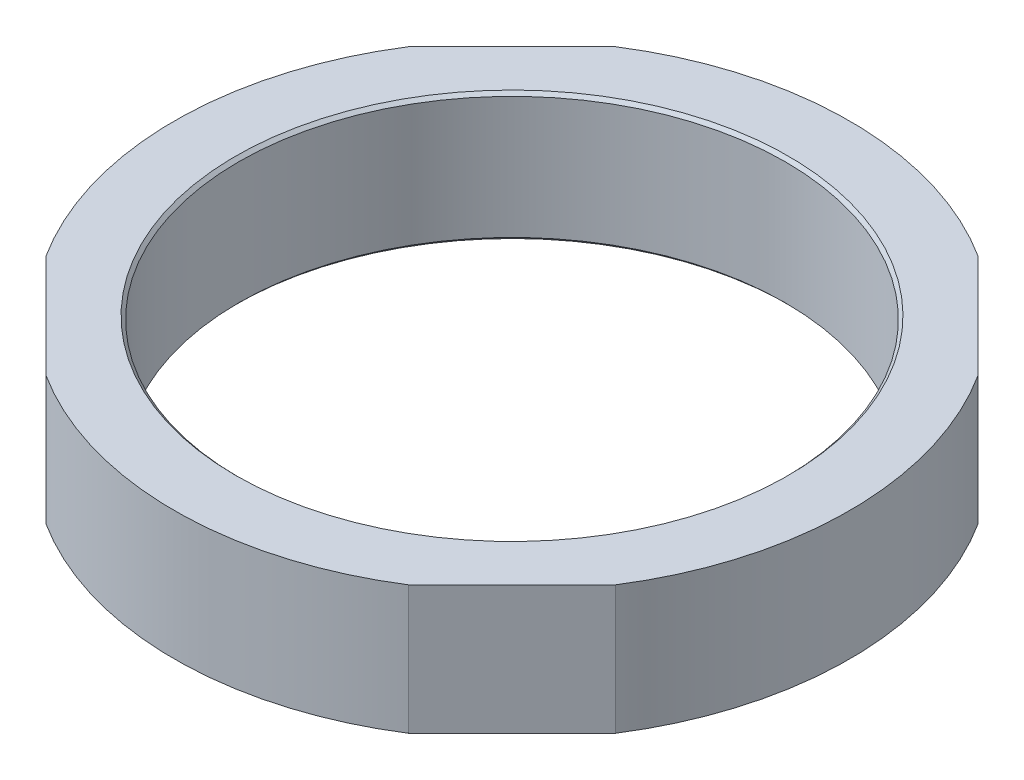
ISO-10303-21;
HEADER;
FILE_DESCRIPTION(('STEP AP214'),'2;1');
FILE_NAME('part.step','',(''),(''),'','','');
FILE_SCHEMA(('AUTOMOTIVE_DESIGN { 1 0 10303 214 1 1 1 1 }'));
ENDSEC;
DATA;
#1=APPLICATION_CONTEXT('core data for automotive mechanical design processes');
#2=APPLICATION_PROTOCOL_DEFINITION('international standard','automotive_design',2000,#1);
#3=PRODUCT_CONTEXT('',#1,'mechanical');
#4=PRODUCT('Part','Part','',(#3));
#5=PRODUCT_RELATED_PRODUCT_CATEGORY('part','',(#4));
#6=PRODUCT_DEFINITION_FORMATION('','',#4);
#7=PRODUCT_DEFINITION_CONTEXT('part definition',#1,'design');
#8=PRODUCT_DEFINITION('design','',#6,#7);
#9=PRODUCT_DEFINITION_SHAPE('','',#8);
#10=(LENGTH_UNIT() NAMED_UNIT(*) SI_UNIT(.MILLI.,.METRE.));
#11=(NAMED_UNIT(*) PLANE_ANGLE_UNIT() SI_UNIT($,.RADIAN.));
#12=(NAMED_UNIT(*) SI_UNIT($,.STERADIAN.) SOLID_ANGLE_UNIT());
#13=UNCERTAINTY_MEASURE_WITH_UNIT(LENGTH_MEASURE(1.E-05),#10,'distance_accuracy_value','');
#14=(GEOMETRIC_REPRESENTATION_CONTEXT(3) GLOBAL_UNCERTAINTY_ASSIGNED_CONTEXT((#13)) GLOBAL_UNIT_ASSIGNED_CONTEXT((#10,
#11,#12)) REPRESENTATION_CONTEXT('',''));
#15=CARTESIAN_POINT('',(0.,0.,0.));
#16=DIRECTION('',(0.,0.,1.));
#17=DIRECTION('',(1.,0.,0.));
#18=AXIS2_PLACEMENT_3D('',#15,#16,#17);
#19=CARTESIAN_POINT('',(0.,4.,0.));
#20=DIRECTION('',(0.,-1.,0.));
#21=DIRECTION('',(0.,0.,-1.));
#22=AXIS2_PLACEMENT_3D('',#19,#20,#21);
#23=CYLINDRICAL_SURFACE('',#22,21.);
#24=CARTESIAN_POINT('',(0.,4.,0.));
#25=DIRECTION('',(0.,1.,0.));
#26=DIRECTION('',(0.,0.,1.));
#27=AXIS2_PLACEMENT_3D('',#24,#25,#26);
#28=CIRCLE('',#27,21.);
#29=CARTESIAN_POINT('',(17.7167136960055,4.,11.274664332643));
#30=VERTEX_POINT('',#29);
#31=CARTESIAN_POINT('',(17.7167136960055,4.,-11.274664332643));
#32=VERTEX_POINT('',#31);
#33=EDGE_CURVE('E108',#30,#32,#28,.T.);
#34=ORIENTED_EDGE('',*,*,#33,.F.);
#35=DIRECTION('',(0.,1.,0.));
#36=VECTOR('',#35,1.);
#37=CARTESIAN_POINT('',(17.7167136960055,-4.,11.274664332643));
#38=LINE('',#37,#36);
#39=CARTESIAN_POINT('',(17.7167136960055,-4.,11.274664332643));
#40=VERTEX_POINT('',#39);
#41=EDGE_CURVE('E95',#40,#30,#38,.T.);
#42=ORIENTED_EDGE('',*,*,#41,.F.);
#43=CARTESIAN_POINT('',(0.,-4.,0.));
#44=DIRECTION('',(0.,1.,0.));
#45=DIRECTION('',(0.,0.,1.));
#46=AXIS2_PLACEMENT_3D('',#43,#44,#45);
#47=CIRCLE('',#46,21.);
#48=CARTESIAN_POINT('',(17.7167136960055,-4.,-11.274664332643));
#49=VERTEX_POINT('',#48);
#50=EDGE_CURVE('E124',#40,#49,#47,.T.);
#51=ORIENTED_EDGE('',*,*,#50,.T.);
#52=DIRECTION('',(0.,1.,0.));
#53=VECTOR('',#52,1.);
#54=CARTESIAN_POINT('',(17.7167136960055,-4.,-11.274664332643));
#55=LINE('',#54,#53);
#56=EDGE_CURVE('E116',#49,#32,#55,.T.);
#57=ORIENTED_EDGE('',*,*,#56,.T.);
#58=EDGE_LOOP('',(#34,#42,#51,#57));
#59=FACE_BOUND('',#58,.T.);
#60=ADVANCED_FACE('F32',(#59),#23,.T.);
#61=CARTESIAN_POINT('',(-11.2746643326429,-4.,17.7167136960055));
#62=VERTEX_POINT('',#61);
#63=CARTESIAN_POINT('',(11.2746643326429,-4.,17.7167136960055));
#64=VERTEX_POINT('',#63);
#65=EDGE_CURVE('E175',#62,#64,#47,.T.);
#66=ORIENTED_EDGE('',*,*,#65,.T.);
#67=DIRECTION('',(0.,1.,0.));
#68=VECTOR('',#67,1.);
#69=CARTESIAN_POINT('',(11.2746643326429,-4.,17.7167136960055));
#70=LINE('',#69,#68);
#71=CARTESIAN_POINT('',(11.2746643326429,4.,17.7167136960055));
#72=VERTEX_POINT('',#71);
#73=EDGE_CURVE('E102',#64,#72,#70,.T.);
#74=ORIENTED_EDGE('',*,*,#73,.T.);
#75=CARTESIAN_POINT('',(-11.2746643326429,4.,17.7167136960055));
#76=VERTEX_POINT('',#75);
#77=EDGE_CURVE('E111',#76,#72,#28,.T.);
#78=ORIENTED_EDGE('',*,*,#77,.F.);
#79=DIRECTION('',(0.,1.,0.));
#80=VECTOR('',#79,1.);
#81=CARTESIAN_POINT('',(-11.2746643326429,-4.,17.7167136960055));
#82=LINE('',#81,#80);
#83=EDGE_CURVE('E143',#62,#76,#82,.T.);
#84=ORIENTED_EDGE('',*,*,#83,.F.);
#85=EDGE_LOOP('',(#66,#74,#78,#84));
#86=FACE_BOUND('',#85,.T.);
#87=ADVANCED_FACE('F207',(#86),#23,.T.);
#88=CARTESIAN_POINT('',(-17.7167136960054,-4.,-11.2746643326431));
#89=VERTEX_POINT('',#88);
#90=CARTESIAN_POINT('',(-17.7167136960055,-4.,11.274664332643));
#91=VERTEX_POINT('',#90);
#92=EDGE_CURVE('E122',#89,#91,#47,.T.);
#93=ORIENTED_EDGE('',*,*,#92,.T.);
#94=DIRECTION('',(0.,1.,0.));
#95=VECTOR('',#94,1.);
#96=CARTESIAN_POINT('',(-17.7167136960055,-4.,11.274664332643));
#97=LINE('',#96,#95);
#98=CARTESIAN_POINT('',(-17.7167136960055,4.,11.274664332643));
#99=VERTEX_POINT('',#98);
#100=EDGE_CURVE('E112',#91,#99,#97,.T.);
#101=ORIENTED_EDGE('',*,*,#100,.T.);
#102=CARTESIAN_POINT('',(-17.7167136960054,4.,-11.2746643326431));
#103=VERTEX_POINT('',#102);
#104=EDGE_CURVE('E120',#103,#99,#28,.T.);
#105=ORIENTED_EDGE('',*,*,#104,.F.);
#106=DIRECTION('',(0.,1.,0.));
#107=VECTOR('',#106,1.);
#108=CARTESIAN_POINT('',(-17.7167136960054,-4.,-11.2746643326431));
#109=LINE('',#108,#107);
#110=EDGE_CURVE('E140',#89,#103,#109,.T.);
#111=ORIENTED_EDGE('',*,*,#110,.F.);
#112=EDGE_LOOP('',(#93,#101,#105,#111));
#113=FACE_BOUND('',#112,.T.);
#114=ADVANCED_FACE('F139',(#113),#23,.T.);
#115=CARTESIAN_POINT('',(0.,4.,0.));
#116=DIRECTION('',(0.,1.,0.));
#117=DIRECTION('',(0.,0.,1.));
#118=AXIS2_PLACEMENT_3D('',#115,#116,#117);
#119=PLANE('',#118);
#120=CARTESIAN_POINT('',(0.,4.,0.));
#121=DIRECTION('',(0.,1.,0.));
#122=DIRECTION('',(0.,0.,1.));
#123=AXIS2_PLACEMENT_3D('',#120,#121,#122);
#124=CIRCLE('',#123,17.2);
#125=CARTESIAN_POINT('',(0.,4.,17.2));
#126=VERTEX_POINT('',#125);
#127=EDGE_CURVE('E40',#126,#126,#124,.F.);
#128=ORIENTED_EDGE('',*,*,#127,.T.);
#129=EDGE_LOOP('',(#128));
#130=FACE_BOUND('',#129,.T.);
#131=DIRECTION('',(-0.707106781186548,0.,0.707106781186547));
#132=VECTOR('',#131,1.);
#133=CARTESIAN_POINT('',(17.7167136960055,4.,11.274664332643));
#134=LINE('',#133,#132);
#135=EDGE_CURVE('E47',#30,#72,#134,.T.);
#136=ORIENTED_EDGE('',*,*,#135,.F.);
#137=ORIENTED_EDGE('',*,*,#33,.T.);
#138=DIRECTION('',(0.70710678118655,0.,0.707106781186546));
#139=VECTOR('',#138,1.);
#140=CARTESIAN_POINT('',(11.2746643326429,4.,-17.7167136960055));
#141=LINE('',#140,#139);
#142=CARTESIAN_POINT('',(11.2746643326429,4.,-17.7167136960055));
#143=VERTEX_POINT('',#142);
#144=EDGE_CURVE('E158',#143,#32,#141,.T.);
#145=ORIENTED_EDGE('',*,*,#144,.F.);
#146=CARTESIAN_POINT('',(-11.2746643326428,4.,-17.7167136960056));
#147=VERTEX_POINT('',#146);
#148=EDGE_CURVE('E119',#143,#147,#28,.T.);
#149=ORIENTED_EDGE('',*,*,#148,.T.);
#150=DIRECTION('',(0.707106781186553,0.,-0.707106781186542));
#151=VECTOR('',#150,1.);
#152=CARTESIAN_POINT('',(-17.7167136960054,4.,-11.2746643326431));
#153=LINE('',#152,#151);
#154=EDGE_CURVE('E135',#103,#147,#153,.T.);
#155=ORIENTED_EDGE('',*,*,#154,.F.);
#156=ORIENTED_EDGE('',*,*,#104,.T.);
#157=DIRECTION('',(-0.70710678118655,0.,-0.707106781186546));
#158=VECTOR('',#157,1.);
#159=CARTESIAN_POINT('',(-11.2746643326429,4.,17.7167136960055));
#160=LINE('',#159,#158);
#161=EDGE_CURVE('E55',#76,#99,#160,.T.);
#162=ORIENTED_EDGE('',*,*,#161,.F.);
#163=ORIENTED_EDGE('',*,*,#77,.T.);
#164=EDGE_LOOP('',(#136,#137,#145,#149,#155,#156,#162,#163));
#165=FACE_BOUND('',#164,.T.);
#166=ADVANCED_FACE('F106',(#130,#165),#119,.T.);
#167=CARTESIAN_POINT('',(0.,-4.,0.));
#168=DIRECTION('',(0.,1.,0.));
#169=DIRECTION('',(0.,0.,1.));
#170=AXIS2_PLACEMENT_3D('',#167,#168,#169);
#171=PLANE('',#170);
#172=CARTESIAN_POINT('',(0.,-4.,0.));
#173=DIRECTION('',(0.,1.,0.));
#174=DIRECTION('',(0.,0.,1.));
#175=AXIS2_PLACEMENT_3D('',#172,#173,#174);
#176=CIRCLE('',#175,17.2);
#177=CARTESIAN_POINT('',(0.,-4.,17.2));
#178=VERTEX_POINT('',#177);
#179=EDGE_CURVE('E11',#178,#178,#176,.T.);
#180=ORIENTED_EDGE('',*,*,#179,.T.);
#181=EDGE_LOOP('',(#180));
#182=FACE_BOUND('',#181,.T.);
#183=ORIENTED_EDGE('',*,*,#50,.F.);
#184=DIRECTION('',(-0.707106781186548,0.,0.707106781186547));
#185=VECTOR('',#184,1.);
#186=CARTESIAN_POINT('',(17.7167136960055,-4.,11.274664332643));
#187=LINE('',#186,#185);
#188=EDGE_CURVE('E98',#40,#64,#187,.T.);
#189=ORIENTED_EDGE('',*,*,#188,.T.);
#190=ORIENTED_EDGE('',*,*,#65,.F.);
#191=DIRECTION('',(-0.70710678118655,0.,-0.707106781186546));
#192=VECTOR('',#191,1.);
#193=CARTESIAN_POINT('',(-11.2746643326429,-4.,17.7167136960055));
#194=LINE('',#193,#192);
#195=EDGE_CURVE('E145',#62,#91,#194,.T.);
#196=ORIENTED_EDGE('',*,*,#195,.T.);
#197=ORIENTED_EDGE('',*,*,#92,.F.);
#198=DIRECTION('',(0.707106781186553,0.,-0.707106781186542));
#199=VECTOR('',#198,1.);
#200=CARTESIAN_POINT('',(-17.7167136960054,-4.,-11.2746643326431));
#201=LINE('',#200,#199);
#202=CARTESIAN_POINT('',(-11.2746643326428,-4.,-17.7167136960056));
#203=VERTEX_POINT('',#202);
#204=EDGE_CURVE('E151',#89,#203,#201,.T.);
#205=ORIENTED_EDGE('',*,*,#204,.T.);
#206=CARTESIAN_POINT('',(11.2746643326429,-4.,-17.7167136960055));
#207=VERTEX_POINT('',#206);
#208=EDGE_CURVE('E117',#207,#203,#47,.T.);
#209=ORIENTED_EDGE('',*,*,#208,.F.);
#210=DIRECTION('',(0.70710678118655,0.,0.707106781186546));
#211=VECTOR('',#210,1.);
#212=CARTESIAN_POINT('',(11.2746643326429,-4.,-17.7167136960055));
#213=LINE('',#212,#211);
#214=EDGE_CURVE('E160',#207,#49,#213,.T.);
#215=ORIENTED_EDGE('',*,*,#214,.T.);
#216=EDGE_LOOP('',(#183,#189,#190,#196,#197,#205,#209,#215));
#217=FACE_BOUND('',#216,.T.);
#218=ADVANCED_FACE('F173',(#182,#217),#171,.F.);
#219=ORIENTED_EDGE('',*,*,#208,.T.);
#220=DIRECTION('',(0.,1.,0.));
#221=VECTOR('',#220,1.);
#222=CARTESIAN_POINT('',(-11.2746643326428,-4.,-17.7167136960056));
#223=LINE('',#222,#221);
#224=EDGE_CURVE('E154',#203,#147,#223,.T.);
#225=ORIENTED_EDGE('',*,*,#224,.T.);
#226=ORIENTED_EDGE('',*,*,#148,.F.);
#227=DIRECTION('',(0.,1.,0.));
#228=VECTOR('',#227,1.);
#229=CARTESIAN_POINT('',(11.2746643326429,-4.,-17.7167136960055));
#230=LINE('',#229,#228);
#231=EDGE_CURVE('E163',#207,#143,#230,.T.);
#232=ORIENTED_EDGE('',*,*,#231,.F.);
#233=EDGE_LOOP('',(#219,#225,#226,#232));
#234=FACE_BOUND('',#233,.T.);
#235=ADVANCED_FACE('F169',(#234),#23,.T.);
#236=CARTESIAN_POINT('',(0.,4.,0.));
#237=DIRECTION('',(0.,-1.,0.));
#238=DIRECTION('',(0.,0.,-1.));
#239=AXIS2_PLACEMENT_3D('',#236,#237,#238);
#240=CYLINDRICAL_SURFACE('',#239,17.);
#241=CARTESIAN_POINT('',(0.,3.8,0.));
#242=DIRECTION('',(0.,1.,0.));
#243=DIRECTION('',(0.,0.,1.));
#244=AXIS2_PLACEMENT_3D('',#241,#242,#243);
#245=CIRCLE('',#244,17.);
#246=CARTESIAN_POINT('',(0.,3.8,17.));
#247=VERTEX_POINT('',#246);
#248=EDGE_CURVE('E131',#247,#247,#245,.T.);
#249=ORIENTED_EDGE('',*,*,#248,.T.);
#250=EDGE_LOOP('',(#249));
#251=FACE_BOUND('',#250,.T.);
#252=CARTESIAN_POINT('',(0.,-3.8,0.));
#253=DIRECTION('',(0.,1.,0.));
#254=DIRECTION('',(0.,0.,1.));
#255=AXIS2_PLACEMENT_3D('',#252,#253,#254);
#256=CIRCLE('',#255,17.);
#257=CARTESIAN_POINT('',(0.,-3.8,17.));
#258=VERTEX_POINT('',#257);
#259=EDGE_CURVE('E127',#258,#258,#256,.F.);
#260=ORIENTED_EDGE('',*,*,#259,.T.);
#261=EDGE_LOOP('',(#260));
#262=FACE_BOUND('',#261,.T.);
#263=ADVANCED_FACE('F188',(#251,#262),#240,.F.);
#264=CARTESIAN_POINT('',(11.2746643326429,-4.,-17.7167136960055));
#265=DIRECTION('',(-0.707106781186546,0.,0.70710678118655));
#266=DIRECTION('',(0.70710678118655,0.,0.707106781186546));
#267=AXIS2_PLACEMENT_3D('',#264,#265,#266);
#268=PLANE('',#267);
#269=ORIENTED_EDGE('',*,*,#56,.F.);
#270=ORIENTED_EDGE('',*,*,#214,.F.);
#271=ORIENTED_EDGE('',*,*,#231,.T.);
#272=ORIENTED_EDGE('',*,*,#144,.T.);
#273=EDGE_LOOP('',(#269,#270,#271,#272));
#274=FACE_BOUND('',#273,.T.);
#275=ADVANCED_FACE('F166',(#274),#268,.F.);
#276=CARTESIAN_POINT('',(-17.7167136960054,-4.,-11.2746643326431));
#277=DIRECTION('',(0.707106781186542,0.,0.707106781186553));
#278=DIRECTION('',(0.707106781186553,0.,-0.707106781186542));
#279=AXIS2_PLACEMENT_3D('',#276,#277,#278);
#280=PLANE('',#279);
#281=ORIENTED_EDGE('',*,*,#224,.F.);
#282=ORIENTED_EDGE('',*,*,#204,.F.);
#283=ORIENTED_EDGE('',*,*,#110,.T.);
#284=ORIENTED_EDGE('',*,*,#154,.T.);
#285=EDGE_LOOP('',(#281,#282,#283,#284));
#286=FACE_BOUND('',#285,.T.);
#287=ADVANCED_FACE('F171',(#286),#280,.F.);
#288=CARTESIAN_POINT('',(-11.2746643326429,-4.,17.7167136960055));
#289=DIRECTION('',(0.707106781186546,0.,-0.70710678118655));
#290=DIRECTION('',(-0.70710678118655,0.,-0.707106781186546));
#291=AXIS2_PLACEMENT_3D('',#288,#289,#290);
#292=PLANE('',#291);
#293=ORIENTED_EDGE('',*,*,#100,.F.);
#294=ORIENTED_EDGE('',*,*,#195,.F.);
#295=ORIENTED_EDGE('',*,*,#83,.T.);
#296=ORIENTED_EDGE('',*,*,#161,.T.);
#297=EDGE_LOOP('',(#293,#294,#295,#296));
#298=FACE_BOUND('',#297,.T.);
#299=ADVANCED_FACE('F218',(#298),#292,.F.);
#300=CARTESIAN_POINT('',(17.7167136960055,-4.,11.274664332643));
#301=DIRECTION('',(-0.707106781186547,0.,-0.707106781186548));
#302=DIRECTION('',(-0.707106781186548,0.,0.707106781186547));
#303=AXIS2_PLACEMENT_3D('',#300,#301,#302);
#304=PLANE('',#303);
#305=ORIENTED_EDGE('',*,*,#73,.F.);
#306=ORIENTED_EDGE('',*,*,#188,.F.);
#307=ORIENTED_EDGE('',*,*,#41,.T.);
#308=ORIENTED_EDGE('',*,*,#135,.T.);
#309=EDGE_LOOP('',(#305,#306,#307,#308));
#310=FACE_BOUND('',#309,.T.);
#311=ADVANCED_FACE('F96',(#310),#304,.F.);
#312=CARTESIAN_POINT('',(0.,3.8,0.));
#313=DIRECTION('',(0.,1.,0.));
#314=DIRECTION('',(0.,0.,1.));
#315=AXIS2_PLACEMENT_3D('',#312,#313,#314);
#316=CONICAL_SURFACE('',#315,17.,0.785398163397431);
#317=ORIENTED_EDGE('',*,*,#127,.F.);
#318=EDGE_LOOP('',(#317));
#319=FACE_BOUND('',#318,.T.);
#320=ORIENTED_EDGE('',*,*,#248,.F.);
#321=EDGE_LOOP('',(#320));
#322=FACE_BOUND('',#321,.T.);
#323=ADVANCED_FACE('F183',(#319,#322),#316,.F.);
#324=CARTESIAN_POINT('',(0.,-4.,0.));
#325=DIRECTION('',(0.,-1.,0.));
#326=DIRECTION('',(0.,0.,-1.));
#327=AXIS2_PLACEMENT_3D('',#324,#325,#326);
#328=CONICAL_SURFACE('',#327,17.2,0.78539816339744);
#329=ORIENTED_EDGE('',*,*,#259,.F.);
#330=EDGE_LOOP('',(#329));
#331=FACE_BOUND('',#330,.T.);
#332=ORIENTED_EDGE('',*,*,#179,.F.);
#333=EDGE_LOOP('',(#332));
#334=FACE_BOUND('',#333,.T.);
#335=ADVANCED_FACE('F34',(#331,#334),#328,.F.);
#336=CLOSED_SHELL('',(#60,#87,#114,#166,#218,#235,#263,#275,#287,#299,#311,#323,#335));
#337=MANIFOLD_SOLID_BREP('B2',#336);
#338=ADVANCED_BREP_SHAPE_REPRESENTATION('',(#18,#337),#14);
#339=SHAPE_DEFINITION_REPRESENTATION(#9,#338);
ENDSEC;
END-ISO-10303-21;
